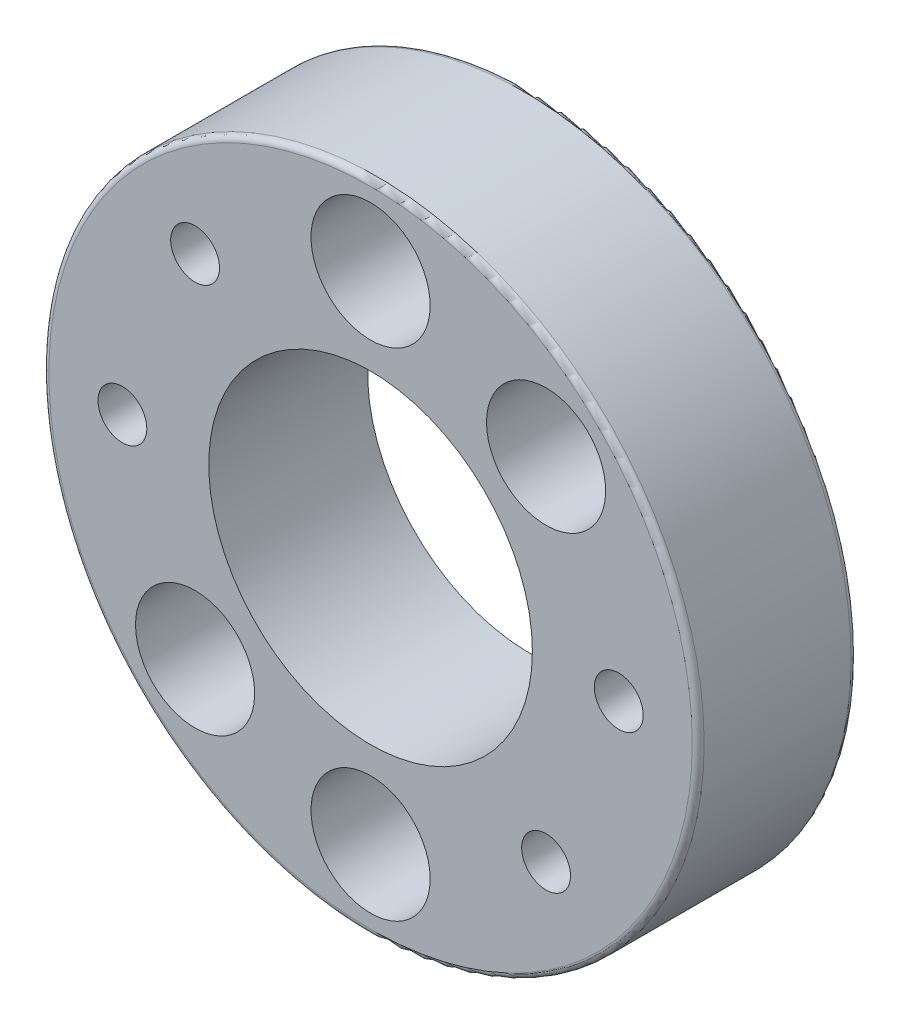
ISO-10303-21;
HEADER;
FILE_DESCRIPTION(('STEP AP214'),'2;1');
FILE_NAME('part.step','',(''),(''),'','','');
FILE_SCHEMA(('AUTOMOTIVE_DESIGN { 1 0 10303 214 1 1 1 1 }'));
ENDSEC;
DATA;
#1=APPLICATION_CONTEXT('core data for automotive mechanical design processes');
#2=APPLICATION_PROTOCOL_DEFINITION('international standard','automotive_design',2000,#1);
#3=PRODUCT_CONTEXT('',#1,'mechanical');
#4=PRODUCT('Part','Part','',(#3));
#5=PRODUCT_RELATED_PRODUCT_CATEGORY('part','',(#4));
#6=PRODUCT_DEFINITION_FORMATION('','',#4);
#7=PRODUCT_DEFINITION_CONTEXT('part definition',#1,'design');
#8=PRODUCT_DEFINITION('design','',#6,#7);
#9=PRODUCT_DEFINITION_SHAPE('','',#8);
#10=(LENGTH_UNIT() NAMED_UNIT(*) SI_UNIT(.MILLI.,.METRE.));
#11=(NAMED_UNIT(*) PLANE_ANGLE_UNIT() SI_UNIT($,.RADIAN.));
#12=(NAMED_UNIT(*) SI_UNIT($,.STERADIAN.) SOLID_ANGLE_UNIT());
#13=UNCERTAINTY_MEASURE_WITH_UNIT(LENGTH_MEASURE(1.E-05),#10,'distance_accuracy_value','');
#14=(GEOMETRIC_REPRESENTATION_CONTEXT(3) GLOBAL_UNCERTAINTY_ASSIGNED_CONTEXT((#13)) GLOBAL_UNIT_ASSIGNED_CONTEXT((#10,
#11,#12)) REPRESENTATION_CONTEXT('',''));
#15=CARTESIAN_POINT('',(0.,0.,0.));
#16=DIRECTION('',(0.,0.,1.));
#17=DIRECTION('',(1.,0.,0.));
#18=AXIS2_PLACEMENT_3D('',#15,#16,#17);
#19=CARTESIAN_POINT('',(0.,0.,8.));
#20=DIRECTION('',(0.,0.,1.));
#21=DIRECTION('',(1.,0.,0.));
#22=AXIS2_PLACEMENT_3D('',#19,#20,#21);
#23=PLANE('',#22);
#24=CARTESIAN_POINT('',(0.,0.,8.));
#25=DIRECTION('',(0.,0.,1.));
#26=DIRECTION('',(1.,0.,0.));
#27=AXIS2_PLACEMENT_3D('',#24,#25,#26);
#28=CIRCLE('',#27,16.2);
#29=CARTESIAN_POINT('',(16.2,0.,8.));
#30=VERTEX_POINT('',#29);
#31=EDGE_CURVE('E10',#30,#30,#28,.T.);
#32=ORIENTED_EDGE('',*,*,#31,.T.);
#33=EDGE_LOOP('',(#32));
#34=FACE_BOUND('',#33,.T.);
#35=CARTESIAN_POINT('',(-8.83883476483183,8.83883476483186,8.));
#36=DIRECTION('',(0.,0.,1.));
#37=DIRECTION('',(1.,0.,0.));
#38=AXIS2_PLACEMENT_3D('',#35,#36,#37);
#39=CIRCLE('',#38,1.2295);
#40=CARTESIAN_POINT('',(-7.60933476483183,8.83883476483186,8.));
#41=VERTEX_POINT('',#40);
#42=EDGE_CURVE('E110',#41,#41,#39,.T.);
#43=ORIENTED_EDGE('',*,*,#42,.F.);
#44=EDGE_LOOP('',(#43));
#45=FACE_BOUND('',#44,.T.);
#46=CARTESIAN_POINT('',(8.83883476483183,-8.83883476483186,8.));
#47=DIRECTION('',(0.,0.,1.));
#48=DIRECTION('',(1.,0.,0.));
#49=AXIS2_PLACEMENT_3D('',#46,#47,#48);
#50=CIRCLE('',#49,1.2295);
#51=CARTESIAN_POINT('',(10.0683347648318,-8.83883476483186,8.));
#52=VERTEX_POINT('',#51);
#53=EDGE_CURVE('E104',#52,#52,#50,.T.);
#54=ORIENTED_EDGE('',*,*,#53,.F.);
#55=EDGE_LOOP('',(#54));
#56=FACE_BOUND('',#55,.T.);
#57=CARTESIAN_POINT('',(-8.83883476483186,-8.83883476483183,8.));
#58=DIRECTION('',(0.,0.,1.));
#59=DIRECTION('',(0.707106781186546,-0.707106781186549,0.));
#60=AXIS2_PLACEMENT_3D('',#57,#58,#59);
#61=CIRCLE('',#60,3.);
#62=CARTESIAN_POINT('',(-6.71751442127222,-10.9601551083915,8.));
#63=VERTEX_POINT('',#62);
#64=EDGE_CURVE('E96',#63,#63,#61,.T.);
#65=ORIENTED_EDGE('',*,*,#64,.F.);
#66=EDGE_LOOP('',(#65));
#67=FACE_BOUND('',#66,.T.);
#68=CARTESIAN_POINT('',(8.83883476483186,8.83883476483183,8.));
#69=DIRECTION('',(0.,0.,1.));
#70=DIRECTION('',(0.707106781186546,-0.707106781186549,0.));
#71=AXIS2_PLACEMENT_3D('',#68,#69,#70);
#72=CIRCLE('',#71,3.);
#73=CARTESIAN_POINT('',(10.9601551083915,6.71751442127218,8.));
#74=VERTEX_POINT('',#73);
#75=EDGE_CURVE('E90',#74,#74,#72,.T.);
#76=ORIENTED_EDGE('',*,*,#75,.F.);
#77=EDGE_LOOP('',(#76));
#78=FACE_BOUND('',#77,.T.);
#79=CARTESIAN_POINT('',(-12.5,0.,8.));
#80=DIRECTION('',(0.,0.,1.));
#81=DIRECTION('',(1.,0.,0.));
#82=AXIS2_PLACEMENT_3D('',#79,#80,#81);
#83=CIRCLE('',#82,1.2295);
#84=CARTESIAN_POINT('',(-11.2705,0.,8.));
#85=VERTEX_POINT('',#84);
#86=EDGE_CURVE('E86',#85,#85,#83,.T.);
#87=ORIENTED_EDGE('',*,*,#86,.F.);
#88=EDGE_LOOP('',(#87));
#89=FACE_BOUND('',#88,.T.);
#90=CARTESIAN_POINT('',(12.5,0.,8.));
#91=DIRECTION('',(0.,0.,1.));
#92=DIRECTION('',(1.,0.,0.));
#93=AXIS2_PLACEMENT_3D('',#90,#91,#92);
#94=CIRCLE('',#93,1.2295);
#95=CARTESIAN_POINT('',(13.7295,0.,8.));
#96=VERTEX_POINT('',#95);
#97=EDGE_CURVE('E80',#96,#96,#94,.T.);
#98=ORIENTED_EDGE('',*,*,#97,.F.);
#99=EDGE_LOOP('',(#98));
#100=FACE_BOUND('',#99,.T.);
#101=CARTESIAN_POINT('',(0.,-12.5,8.));
#102=DIRECTION('',(0.,0.,1.));
#103=DIRECTION('',(1.,0.,0.));
#104=AXIS2_PLACEMENT_3D('',#101,#102,#103);
#105=CIRCLE('',#104,3.);
#106=CARTESIAN_POINT('',(3.,-12.5,8.));
#107=VERTEX_POINT('',#106);
#108=EDGE_CURVE('E72',#107,#107,#105,.T.);
#109=ORIENTED_EDGE('',*,*,#108,.F.);
#110=EDGE_LOOP('',(#109));
#111=FACE_BOUND('',#110,.T.);
#112=CARTESIAN_POINT('',(0.,12.5,8.));
#113=DIRECTION('',(0.,0.,1.));
#114=DIRECTION('',(1.,0.,0.));
#115=AXIS2_PLACEMENT_3D('',#112,#113,#114);
#116=CIRCLE('',#115,3.);
#117=CARTESIAN_POINT('',(3.,12.5,8.));
#118=VERTEX_POINT('',#117);
#119=EDGE_CURVE('E66',#118,#118,#116,.T.);
#120=ORIENTED_EDGE('',*,*,#119,.F.);
#121=EDGE_LOOP('',(#120));
#122=FACE_BOUND('',#121,.T.);
#123=CARTESIAN_POINT('',(0.,0.,8.));
#124=DIRECTION('',(0.,0.,1.));
#125=DIRECTION('',(1.,0.,0.));
#126=AXIS2_PLACEMENT_3D('',#123,#124,#125);
#127=CIRCLE('',#126,8.15);
#128=CARTESIAN_POINT('',(8.15,0.,8.));
#129=VERTEX_POINT('',#128);
#130=EDGE_CURVE('E59',#129,#129,#127,.T.);
#131=ORIENTED_EDGE('',*,*,#130,.F.);
#132=EDGE_LOOP('',(#131));
#133=FACE_BOUND('',#132,.T.);
#134=ADVANCED_FACE('F39',(#34,#45,#56,#67,#78,#89,#100,#111,#122,#133),#23,.T.);
#135=CARTESIAN_POINT('',(0.,0.,0.));
#136=DIRECTION('',(0.,0.,1.));
#137=DIRECTION('',(1.,0.,0.));
#138=AXIS2_PLACEMENT_3D('',#135,#136,#137);
#139=PLANE('',#138);
#140=CARTESIAN_POINT('',(0.,0.,0.));
#141=DIRECTION('',(0.,0.,1.));
#142=DIRECTION('',(1.,0.,0.));
#143=AXIS2_PLACEMENT_3D('',#140,#141,#142);
#144=CIRCLE('',#143,16.2);
#145=CARTESIAN_POINT('',(16.2,0.,0.));
#146=VERTEX_POINT('',#145);
#147=EDGE_CURVE('E46',#146,#146,#144,.F.);
#148=ORIENTED_EDGE('',*,*,#147,.T.);
#149=EDGE_LOOP('',(#148));
#150=FACE_BOUND('',#149,.T.);
#151=CARTESIAN_POINT('',(-8.83883476483183,8.83883476483186,0.));
#152=DIRECTION('',(0.,0.,1.));
#153=DIRECTION('',(1.,0.,0.));
#154=AXIS2_PLACEMENT_3D('',#151,#152,#153);
#155=CIRCLE('',#154,1.2295);
#156=CARTESIAN_POINT('',(-7.60933476483183,8.83883476483186,0.));
#157=VERTEX_POINT('',#156);
#158=EDGE_CURVE('E107',#157,#157,#155,.T.);
#159=ORIENTED_EDGE('',*,*,#158,.T.);
#160=EDGE_LOOP('',(#159));
#161=FACE_BOUND('',#160,.T.);
#162=CARTESIAN_POINT('',(8.83883476483183,-8.83883476483186,0.));
#163=DIRECTION('',(0.,0.,1.));
#164=DIRECTION('',(1.,0.,0.));
#165=AXIS2_PLACEMENT_3D('',#162,#163,#164);
#166=CIRCLE('',#165,1.2295);
#167=CARTESIAN_POINT('',(10.0683347648318,-8.83883476483186,0.));
#168=VERTEX_POINT('',#167);
#169=EDGE_CURVE('E99',#168,#168,#166,.T.);
#170=ORIENTED_EDGE('',*,*,#169,.T.);
#171=EDGE_LOOP('',(#170));
#172=FACE_BOUND('',#171,.T.);
#173=CARTESIAN_POINT('',(-8.83883476483186,-8.83883476483183,0.));
#174=DIRECTION('',(0.,0.,1.));
#175=DIRECTION('',(0.707106781186546,-0.707106781186549,0.));
#176=AXIS2_PLACEMENT_3D('',#173,#174,#175);
#177=CIRCLE('',#176,3.);
#178=CARTESIAN_POINT('',(-6.71751442127222,-10.9601551083915,0.));
#179=VERTEX_POINT('',#178);
#180=EDGE_CURVE('E93',#179,#179,#177,.T.);
#181=ORIENTED_EDGE('',*,*,#180,.T.);
#182=EDGE_LOOP('',(#181));
#183=FACE_BOUND('',#182,.T.);
#184=CARTESIAN_POINT('',(8.83883476483186,8.83883476483183,0.));
#185=DIRECTION('',(0.,0.,1.));
#186=DIRECTION('',(0.707106781186546,-0.707106781186549,0.));
#187=AXIS2_PLACEMENT_3D('',#184,#185,#186);
#188=CIRCLE('',#187,3.);
#189=CARTESIAN_POINT('',(10.9601551083915,6.71751442127218,0.));
#190=VERTEX_POINT('',#189);
#191=EDGE_CURVE('E89',#190,#190,#188,.T.);
#192=ORIENTED_EDGE('',*,*,#191,.T.);
#193=EDGE_LOOP('',(#192));
#194=FACE_BOUND('',#193,.T.);
#195=CARTESIAN_POINT('',(-12.5,0.,0.));
#196=DIRECTION('',(0.,0.,1.));
#197=DIRECTION('',(1.,0.,0.));
#198=AXIS2_PLACEMENT_3D('',#195,#196,#197);
#199=CIRCLE('',#198,1.2295);
#200=CARTESIAN_POINT('',(-11.2705,0.,0.));
#201=VERTEX_POINT('',#200);
#202=EDGE_CURVE('E83',#201,#201,#199,.T.);
#203=ORIENTED_EDGE('',*,*,#202,.T.);
#204=EDGE_LOOP('',(#203));
#205=FACE_BOUND('',#204,.T.);
#206=CARTESIAN_POINT('',(12.5,0.,0.));
#207=DIRECTION('',(0.,0.,1.));
#208=DIRECTION('',(1.,0.,0.));
#209=AXIS2_PLACEMENT_3D('',#206,#207,#208);
#210=CIRCLE('',#209,1.2295);
#211=CARTESIAN_POINT('',(13.7295,0.,0.));
#212=VERTEX_POINT('',#211);
#213=EDGE_CURVE('E75',#212,#212,#210,.T.);
#214=ORIENTED_EDGE('',*,*,#213,.T.);
#215=EDGE_LOOP('',(#214));
#216=FACE_BOUND('',#215,.T.);
#217=CARTESIAN_POINT('',(0.,-12.5,0.));
#218=DIRECTION('',(0.,0.,1.));
#219=DIRECTION('',(1.,0.,0.));
#220=AXIS2_PLACEMENT_3D('',#217,#218,#219);
#221=CIRCLE('',#220,3.);
#222=CARTESIAN_POINT('',(3.,-12.5,0.));
#223=VERTEX_POINT('',#222);
#224=EDGE_CURVE('E69',#223,#223,#221,.T.);
#225=ORIENTED_EDGE('',*,*,#224,.T.);
#226=EDGE_LOOP('',(#225));
#227=FACE_BOUND('',#226,.T.);
#228=CARTESIAN_POINT('',(0.,12.5,0.));
#229=DIRECTION('',(0.,0.,1.));
#230=DIRECTION('',(1.,0.,0.));
#231=AXIS2_PLACEMENT_3D('',#228,#229,#230);
#232=CIRCLE('',#231,3.);
#233=CARTESIAN_POINT('',(3.,12.5,0.));
#234=VERTEX_POINT('',#233);
#235=EDGE_CURVE('E63',#234,#234,#232,.T.);
#236=ORIENTED_EDGE('',*,*,#235,.T.);
#237=EDGE_LOOP('',(#236));
#238=FACE_BOUND('',#237,.T.);
#239=CARTESIAN_POINT('',(0.,0.,0.));
#240=DIRECTION('',(0.,0.,1.));
#241=DIRECTION('',(1.,0.,0.));
#242=AXIS2_PLACEMENT_3D('',#239,#240,#241);
#243=CIRCLE('',#242,8.15);
#244=CARTESIAN_POINT('',(8.15,0.,0.));
#245=VERTEX_POINT('',#244);
#246=EDGE_CURVE('E60',#245,#245,#243,.T.);
#247=ORIENTED_EDGE('',*,*,#246,.T.);
#248=EDGE_LOOP('',(#247));
#249=FACE_BOUND('',#248,.T.);
#250=ADVANCED_FACE('F118',(#150,#161,#172,#183,#194,#205,#216,#227,#238,#249),#139,.F.);
#251=CARTESIAN_POINT('',(0.,0.,8.));
#252=DIRECTION('',(0.,0.,-1.));
#253=DIRECTION('',(-1.,0.,0.));
#254=AXIS2_PLACEMENT_3D('',#251,#252,#253);
#255=CYLINDRICAL_SURFACE('',#254,16.5);
#256=CARTESIAN_POINT('',(0.,0.,0.3));
#257=DIRECTION('',(0.,0.,1.));
#258=DIRECTION('',(1.,0.,0.));
#259=AXIS2_PLACEMENT_3D('',#256,#257,#258);
#260=CIRCLE('',#259,16.5);
#261=CARTESIAN_POINT('',(16.5,0.,0.3));
#262=VERTEX_POINT('',#261);
#263=EDGE_CURVE('E50',#262,#262,#260,.T.);
#264=ORIENTED_EDGE('',*,*,#263,.T.);
#265=EDGE_LOOP('',(#264));
#266=FACE_BOUND('',#265,.T.);
#267=CARTESIAN_POINT('',(0.,0.,7.7));
#268=DIRECTION('',(0.,0.,1.));
#269=DIRECTION('',(1.,0.,0.));
#270=AXIS2_PLACEMENT_3D('',#267,#268,#269);
#271=CIRCLE('',#270,16.5);
#272=CARTESIAN_POINT('',(16.5,0.,7.7));
#273=VERTEX_POINT('',#272);
#274=EDGE_CURVE('E54',#273,#273,#271,.F.);
#275=ORIENTED_EDGE('',*,*,#274,.T.);
#276=EDGE_LOOP('',(#275));
#277=FACE_BOUND('',#276,.T.);
#278=ADVANCED_FACE('F140',(#266,#277),#255,.T.);
#279=CARTESIAN_POINT('',(0.,0.,8.));
#280=DIRECTION('',(0.,0.,-1.));
#281=DIRECTION('',(-1.,0.,0.));
#282=AXIS2_PLACEMENT_3D('',#279,#280,#281);
#283=CYLINDRICAL_SURFACE('',#282,8.15);
#284=ORIENTED_EDGE('',*,*,#130,.T.);
#285=EDGE_LOOP('',(#284));
#286=FACE_BOUND('',#285,.T.);
#287=ORIENTED_EDGE('',*,*,#246,.F.);
#288=EDGE_LOOP('',(#287));
#289=FACE_BOUND('',#288,.T.);
#290=ADVANCED_FACE('F136',(#286,#289),#283,.F.);
#291=CARTESIAN_POINT('',(0.,12.5,0.));
#292=DIRECTION('',(0.,0.,1.));
#293=DIRECTION('',(1.,0.,0.));
#294=AXIS2_PLACEMENT_3D('',#291,#292,#293);
#295=CYLINDRICAL_SURFACE('',#294,3.);
#296=ORIENTED_EDGE('',*,*,#235,.F.);
#297=EDGE_LOOP('',(#296));
#298=FACE_BOUND('',#297,.T.);
#299=ORIENTED_EDGE('',*,*,#119,.T.);
#300=EDGE_LOOP('',(#299));
#301=FACE_BOUND('',#300,.T.);
#302=ADVANCED_FACE('F139',(#298,#301),#295,.F.);
#303=CARTESIAN_POINT('',(0.,-12.5,0.));
#304=DIRECTION('',(0.,0.,1.));
#305=DIRECTION('',(1.,0.,0.));
#306=AXIS2_PLACEMENT_3D('',#303,#304,#305);
#307=CYLINDRICAL_SURFACE('',#306,3.);
#308=ORIENTED_EDGE('',*,*,#224,.F.);
#309=EDGE_LOOP('',(#308));
#310=FACE_BOUND('',#309,.T.);
#311=ORIENTED_EDGE('',*,*,#108,.T.);
#312=EDGE_LOOP('',(#311));
#313=FACE_BOUND('',#312,.T.);
#314=ADVANCED_FACE('F190',(#310,#313),#307,.F.);
#315=CARTESIAN_POINT('',(12.5,0.,8.));
#316=DIRECTION('',(0.,0.,1.));
#317=DIRECTION('',(1.,0.,0.));
#318=AXIS2_PLACEMENT_3D('',#315,#316,#317);
#319=CYLINDRICAL_SURFACE('',#318,1.2295);
#320=ORIENTED_EDGE('',*,*,#213,.F.);
#321=EDGE_LOOP('',(#320));
#322=FACE_BOUND('',#321,.T.);
#323=ORIENTED_EDGE('',*,*,#97,.T.);
#324=EDGE_LOOP('',(#323));
#325=FACE_BOUND('',#324,.T.);
#326=ADVANCED_FACE('F186',(#322,#325),#319,.F.);
#327=CARTESIAN_POINT('',(-12.5,0.,8.));
#328=DIRECTION('',(0.,0.,1.));
#329=DIRECTION('',(1.,0.,0.));
#330=AXIS2_PLACEMENT_3D('',#327,#328,#329);
#331=CYLINDRICAL_SURFACE('',#330,1.2295);
#332=ORIENTED_EDGE('',*,*,#202,.F.);
#333=EDGE_LOOP('',(#332));
#334=FACE_BOUND('',#333,.T.);
#335=ORIENTED_EDGE('',*,*,#86,.T.);
#336=EDGE_LOOP('',(#335));
#337=FACE_BOUND('',#336,.T.);
#338=ADVANCED_FACE('F182',(#334,#337),#331,.F.);
#339=CARTESIAN_POINT('',(8.83883476483186,8.83883476483183,0.));
#340=DIRECTION('',(0.,0.,1.));
#341=DIRECTION('',(1.,0.,0.));
#342=AXIS2_PLACEMENT_3D('',#339,#340,#341);
#343=CYLINDRICAL_SURFACE('',#342,3.);
#344=ORIENTED_EDGE('',*,*,#191,.F.);
#345=EDGE_LOOP('',(#344));
#346=FACE_BOUND('',#345,.T.);
#347=ORIENTED_EDGE('',*,*,#75,.T.);
#348=EDGE_LOOP('',(#347));
#349=FACE_BOUND('',#348,.T.);
#350=ADVANCED_FACE('F178',(#346,#349),#343,.F.);
#351=CARTESIAN_POINT('',(-8.83883476483186,-8.83883476483183,0.));
#352=DIRECTION('',(0.,0.,1.));
#353=DIRECTION('',(1.,0.,0.));
#354=AXIS2_PLACEMENT_3D('',#351,#352,#353);
#355=CYLINDRICAL_SURFACE('',#354,3.);
#356=ORIENTED_EDGE('',*,*,#180,.F.);
#357=EDGE_LOOP('',(#356));
#358=FACE_BOUND('',#357,.T.);
#359=ORIENTED_EDGE('',*,*,#64,.T.);
#360=EDGE_LOOP('',(#359));
#361=FACE_BOUND('',#360,.T.);
#362=ADVANCED_FACE('F171',(#358,#361),#355,.F.);
#363=CARTESIAN_POINT('',(8.83883476483183,-8.83883476483186,8.));
#364=DIRECTION('',(0.,0.,1.));
#365=DIRECTION('',(1.,0.,0.));
#366=AXIS2_PLACEMENT_3D('',#363,#364,#365);
#367=CYLINDRICAL_SURFACE('',#366,1.2295);
#368=ORIENTED_EDGE('',*,*,#169,.F.);
#369=EDGE_LOOP('',(#368));
#370=FACE_BOUND('',#369,.T.);
#371=ORIENTED_EDGE('',*,*,#53,.T.);
#372=EDGE_LOOP('',(#371));
#373=FACE_BOUND('',#372,.T.);
#374=ADVANCED_FACE('F160',(#370,#373),#367,.F.);
#375=CARTESIAN_POINT('',(-8.83883476483183,8.83883476483186,8.));
#376=DIRECTION('',(0.,0.,1.));
#377=DIRECTION('',(1.,0.,0.));
#378=AXIS2_PLACEMENT_3D('',#375,#376,#377);
#379=CYLINDRICAL_SURFACE('',#378,1.2295);
#380=ORIENTED_EDGE('',*,*,#158,.F.);
#381=EDGE_LOOP('',(#380));
#382=FACE_BOUND('',#381,.T.);
#383=ORIENTED_EDGE('',*,*,#42,.T.);
#384=EDGE_LOOP('',(#383));
#385=FACE_BOUND('',#384,.T.);
#386=ADVANCED_FACE('F114',(#382,#385),#379,.F.);
#387=CARTESIAN_POINT('',(0.,0.,0.3));
#388=DIRECTION('',(0.,0.,1.));
#389=DIRECTION('',(1.,0.,0.));
#390=AXIS2_PLACEMENT_3D('',#387,#388,#389);
#391=TOROIDAL_SURFACE('',#390,16.2,0.3);
#392=ORIENTED_EDGE('',*,*,#147,.F.);
#393=EDGE_LOOP('',(#392));
#394=FACE_BOUND('',#393,.T.);
#395=ORIENTED_EDGE('',*,*,#263,.F.);
#396=EDGE_LOOP('',(#395));
#397=FACE_BOUND('',#396,.T.);
#398=ADVANCED_FACE('F152',(#394,#397),#391,.T.);
#399=CARTESIAN_POINT('',(0.,0.,7.7));
#400=DIRECTION('',(0.,0.,1.));
#401=DIRECTION('',(1.,0.,0.));
#402=AXIS2_PLACEMENT_3D('',#399,#400,#401);
#403=TOROIDAL_SURFACE('',#402,16.2,0.3);
#404=ORIENTED_EDGE('',*,*,#274,.F.);
#405=EDGE_LOOP('',(#404));
#406=FACE_BOUND('',#405,.T.);
#407=ORIENTED_EDGE('',*,*,#31,.F.);
#408=EDGE_LOOP('',(#407));
#409=FACE_BOUND('',#408,.T.);
#410=ADVANCED_FACE('F41',(#406,#409),#403,.T.);
#411=CLOSED_SHELL('',(#134,#250,#278,#290,#302,#314,#326,#338,#350,#362,#374,#386,#398,#410));
#412=MANIFOLD_SOLID_BREP('B2',#411);
#413=ADVANCED_BREP_SHAPE_REPRESENTATION('',(#18,#412),#14);
#414=SHAPE_DEFINITION_REPRESENTATION(#9,#413);
ENDSEC;
END-ISO-10303-21;
